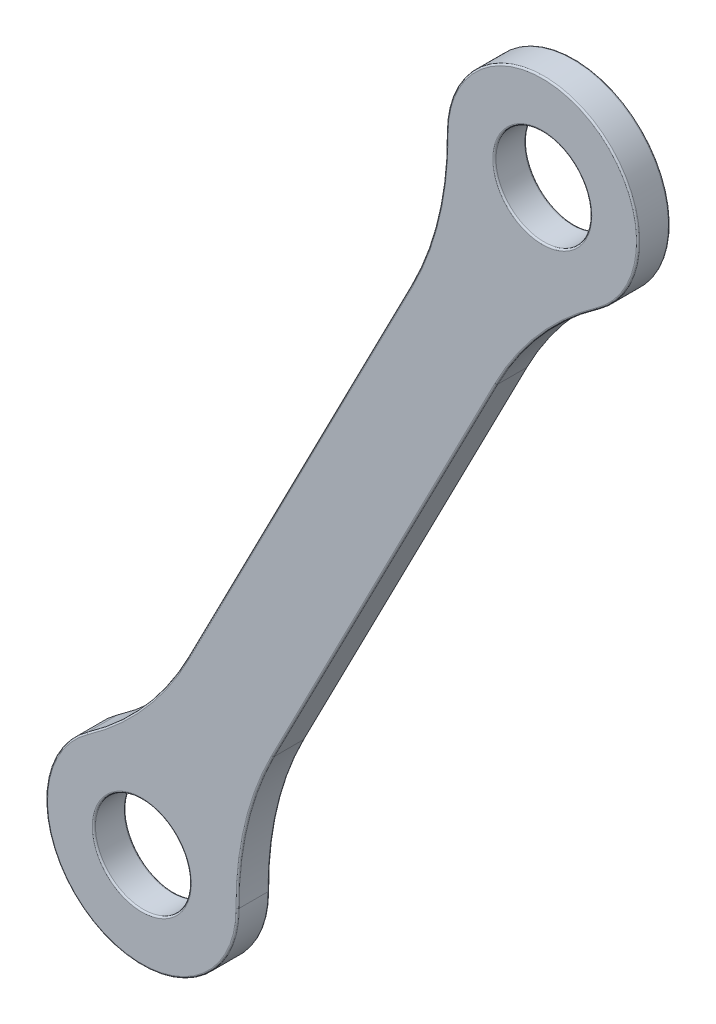
ISO-10303-21;
HEADER;
FILE_DESCRIPTION(('STEP AP214'),'2;1');
FILE_NAME('part.step','',(''),(''),'','','');
FILE_SCHEMA(('AUTOMOTIVE_DESIGN { 1 0 10303 214 1 1 1 1 }'));
ENDSEC;
DATA;
#1=APPLICATION_CONTEXT('core data for automotive mechanical design processes');
#2=APPLICATION_PROTOCOL_DEFINITION('international standard','automotive_design',2000,#1);
#3=PRODUCT_CONTEXT('',#1,'mechanical');
#4=PRODUCT('Part','Part','',(#3));
#5=PRODUCT_RELATED_PRODUCT_CATEGORY('part','',(#4));
#6=PRODUCT_DEFINITION_FORMATION('','',#4);
#7=PRODUCT_DEFINITION_CONTEXT('part definition',#1,'design');
#8=PRODUCT_DEFINITION('design','',#6,#7);
#9=PRODUCT_DEFINITION_SHAPE('','',#8);
#10=(LENGTH_UNIT() NAMED_UNIT(*) SI_UNIT(.MILLI.,.METRE.));
#11=(NAMED_UNIT(*) PLANE_ANGLE_UNIT() SI_UNIT($,.RADIAN.));
#12=(NAMED_UNIT(*) SI_UNIT($,.STERADIAN.) SOLID_ANGLE_UNIT());
#13=UNCERTAINTY_MEASURE_WITH_UNIT(LENGTH_MEASURE(1.E-05),#10,'distance_accuracy_value','');
#14=(GEOMETRIC_REPRESENTATION_CONTEXT(3) GLOBAL_UNCERTAINTY_ASSIGNED_CONTEXT((#13)) GLOBAL_UNIT_ASSIGNED_CONTEXT((#10,
#11,#12)) REPRESENTATION_CONTEXT('',''));
#15=CARTESIAN_POINT('',(0.,0.,0.));
#16=DIRECTION('',(0.,0.,1.));
#17=DIRECTION('',(1.,0.,0.));
#18=AXIS2_PLACEMENT_3D('',#15,#16,#17);
#19=CARTESIAN_POINT('',(-25.6938825812034,13.2208055308789,3.));
#20=DIRECTION('',(-0.889191947851004,0.457534348302876,0.));
#21=DIRECTION('',(-0.457534348302877,-0.889191947851004,0.));
#22=AXIS2_PLACEMENT_3D('',#19,#20,#21);
#23=PLANE('',#22);
#24=DIRECTION('',(0.,0.,-1.));
#25=VECTOR('',#24,1.);
#26=CARTESIAN_POINT('',(18.8195999780896,99.7302236966332,3.));
#27=LINE('',#26,#25);
#28=CARTESIAN_POINT('',(18.8195999780896,99.7302236966332,0.15));
#29=VERTEX_POINT('',#28);
#30=CARTESIAN_POINT('',(18.8195999780896,99.7302236966332,2.85));
#31=VERTEX_POINT('',#30);
#32=EDGE_CURVE('E264',#29,#31,#27,.F.);
#33=ORIENTED_EDGE('',*,*,#32,.T.);
#34=DIRECTION('',(0.457534348302877,0.889191947851004,0.));
#35=VECTOR('',#34,1.);
#36=CARTESIAN_POINT('',(-25.6938825812034,13.2208055308789,2.85));
#37=LINE('',#36,#35);
#38=CARTESIAN_POINT('',(39.7893868769998,140.483810236805,2.85));
#39=VERTEX_POINT('',#38);
#40=EDGE_CURVE('E229',#31,#39,#37,.T.);
#41=ORIENTED_EDGE('',*,*,#40,.T.);
#42=DIRECTION('',(0.,0.,1.));
#43=VECTOR('',#42,1.);
#44=CARTESIAN_POINT('',(39.7893868769998,140.483810236805,0.));
#45=LINE('',#44,#43);
#46=CARTESIAN_POINT('',(39.7893868769998,140.483810236805,0.15));
#47=VERTEX_POINT('',#46);
#48=EDGE_CURVE('E301',#39,#47,#45,.F.);
#49=ORIENTED_EDGE('',*,*,#48,.T.);
#50=DIRECTION('',(0.457534348302877,0.889191947851004,0.));
#51=VECTOR('',#50,1.);
#52=CARTESIAN_POINT('',(18.8195999780896,99.7302236966333,0.15));
#53=LINE('',#52,#51);
#54=EDGE_CURVE('E227',#47,#29,#53,.F.);
#55=ORIENTED_EDGE('',*,*,#54,.T.);
#56=EDGE_LOOP('',(#33,#41,#49,#55));
#57=FACE_BOUND('',#56,.T.);
#58=ADVANCED_FACE('F35',(#57),#23,.T.);
#59=CARTESIAN_POINT('',(14.4999999999999,81.5,3.));
#60=DIRECTION('',(0.,0.,-1.));
#61=DIRECTION('',(-1.,0.,0.));
#62=AXIS2_PLACEMENT_3D('',#59,#60,#61);
#63=CYLINDRICAL_SURFACE('',#62,8.99999999999999);
#64=DIRECTION('',(0.,0.,-1.));
#65=VECTOR('',#64,1.);
#66=CARTESIAN_POINT('',(23.4995582948335,81.5891655644972,3.));
#67=LINE('',#66,#65);
#68=CARTESIAN_POINT('',(23.4995582948335,81.5891655644972,0.15));
#69=VERTEX_POINT('',#68);
#70=CARTESIAN_POINT('',(23.4995582948335,81.5891655644972,2.85));
#71=VERTEX_POINT('',#70);
#72=EDGE_CURVE('E170',#69,#71,#67,.F.);
#73=ORIENTED_EDGE('',*,*,#72,.T.);
#74=CARTESIAN_POINT('',(14.4999999999999,81.5,2.85));
#75=DIRECTION('',(0.,0.,1.));
#76=DIRECTION('',(1.,0.,0.));
#77=AXIS2_PLACEMENT_3D('',#74,#75,#76);
#78=CIRCLE('',#77,8.99999999999999);
#79=CARTESIAN_POINT('',(9.34088650982138,88.8745201874737,2.85));
#80=VERTEX_POINT('',#79);
#81=EDGE_CURVE('E221',#71,#80,#78,.F.);
#82=ORIENTED_EDGE('',*,*,#81,.T.);
#83=DIRECTION('',(0.,0.,-1.));
#84=VECTOR('',#83,1.);
#85=CARTESIAN_POINT('',(9.34088650982138,88.8745201874737,3.));
#86=LINE('',#85,#84);
#87=CARTESIAN_POINT('',(9.34088650982138,88.8745201874737,0.15));
#88=VERTEX_POINT('',#87);
#89=EDGE_CURVE('E320',#80,#88,#86,.T.);
#90=ORIENTED_EDGE('',*,*,#89,.T.);
#91=CARTESIAN_POINT('',(14.4999999999999,81.5,0.15));
#92=DIRECTION('',(0.,0.,1.));
#93=DIRECTION('',(1.,0.,0.));
#94=AXIS2_PLACEMENT_3D('',#91,#92,#93);
#95=CIRCLE('',#94,8.99999999999999);
#96=EDGE_CURVE('E219',#88,#69,#95,.T.);
#97=ORIENTED_EDGE('',*,*,#96,.T.);
#98=EDGE_LOOP('',(#73,#82,#90,#97));
#99=FACE_BOUND('',#98,.T.);
#100=ADVANCED_FACE('F371',(#99),#63,.T.);
#101=CARTESIAN_POINT('',(-17.6911550505444,9.102996396153,3.));
#102=DIRECTION('',(-0.889191947851004,0.457534348302877,0.));
#103=DIRECTION('',(-0.457534348302877,-0.889191947851004,0.));
#104=AXIS2_PLACEMENT_3D('',#101,#102,#103);
#105=PLANE('',#104);
#106=DIRECTION('',(0.,0.,-1.));
#107=VECTOR('',#106,1.);
#108=CARTESIAN_POINT('',(47.7921144076588,136.366001102079,3.));
#109=LINE('',#108,#107);
#110=CARTESIAN_POINT('',(47.7921144076588,136.366001102079,0.15));
#111=VERTEX_POINT('',#110);
#112=CARTESIAN_POINT('',(47.7921144076588,136.366001102079,2.85));
#113=VERTEX_POINT('',#112);
#114=EDGE_CURVE('E317',#111,#113,#109,.F.);
#115=ORIENTED_EDGE('',*,*,#114,.T.);
#116=DIRECTION('',(0.457534348302877,0.889191947851004,0.));
#117=VECTOR('',#116,1.);
#118=CARTESIAN_POINT('',(26.8223275087487,95.6124145619073,2.85));
#119=LINE('',#118,#117);
#120=CARTESIAN_POINT('',(26.8223275087487,95.6124145619073,2.85));
#121=VERTEX_POINT('',#120);
#122=EDGE_CURVE('E212',#113,#121,#119,.F.);
#123=ORIENTED_EDGE('',*,*,#122,.T.);
#124=DIRECTION('',(0.,0.,1.));
#125=VECTOR('',#124,1.);
#126=CARTESIAN_POINT('',(26.8223275087487,95.6124145619073,0.));
#127=LINE('',#126,#125);
#128=CARTESIAN_POINT('',(26.8223275087487,95.6124145619073,0.15));
#129=VERTEX_POINT('',#128);
#130=EDGE_CURVE('E314',#121,#129,#127,.F.);
#131=ORIENTED_EDGE('',*,*,#130,.T.);
#132=DIRECTION('',(0.457534348302877,0.889191947851004,0.));
#133=VECTOR('',#132,1.);
#134=CARTESIAN_POINT('',(-17.6911550505444,9.102996396153,0.15));
#135=LINE('',#134,#133);
#136=EDGE_CURVE('E210',#129,#111,#135,.T.);
#137=ORIENTED_EDGE('',*,*,#136,.T.);
#138=EDGE_LOOP('',(#115,#123,#131,#137));
#139=FACE_BOUND('',#138,.T.);
#140=ADVANCED_FACE('F387',(#139),#105,.F.);
#141=CARTESIAN_POINT('',(52.1117143857485,154.596224798712,3.));
#142=DIRECTION('',(0.,0.,-1.));
#143=DIRECTION('',(-1.,0.,0.));
#144=AXIS2_PLACEMENT_3D('',#141,#142,#143);
#145=CYLINDRICAL_SURFACE('',#144,4.50000000000001);
#146=CARTESIAN_POINT('',(52.1117143857485,154.596224798712,2.85));
#147=DIRECTION('',(0.,0.,1.));
#148=DIRECTION('',(1.,0.,0.));
#149=AXIS2_PLACEMENT_3D('',#146,#147,#148);
#150=CIRCLE('',#149,4.50000000000001);
#151=CARTESIAN_POINT('',(56.6117143857485,154.596224798712,2.85));
#152=VERTEX_POINT('',#151);
#153=EDGE_CURVE('E196',#152,#152,#150,.T.);
#154=ORIENTED_EDGE('',*,*,#153,.T.);
#155=EDGE_LOOP('',(#154));
#156=FACE_BOUND('',#155,.T.);
#157=CARTESIAN_POINT('',(52.1117143857485,154.596224798712,0.15));
#158=DIRECTION('',(0.,0.,1.));
#159=DIRECTION('',(1.,0.,0.));
#160=AXIS2_PLACEMENT_3D('',#157,#158,#159);
#161=CIRCLE('',#160,4.50000000000001);
#162=CARTESIAN_POINT('',(56.6117143857485,154.596224798712,0.15));
#163=VERTEX_POINT('',#162);
#164=EDGE_CURVE('E193',#163,#163,#161,.F.);
#165=ORIENTED_EDGE('',*,*,#164,.T.);
#166=EDGE_LOOP('',(#165));
#167=FACE_BOUND('',#166,.T.);
#168=ADVANCED_FACE('F389',(#156,#167),#145,.F.);
#169=CARTESIAN_POINT('',(52.1117143857485,154.596224798712,3.));
#170=DIRECTION('',(0.,0.,-1.));
#171=DIRECTION('',(-1.,0.,0.));
#172=AXIS2_PLACEMENT_3D('',#169,#170,#171);
#173=CYLINDRICAL_SURFACE('',#172,8.99999999999996);
#174=DIRECTION('',(0.,0.,-1.));
#175=VECTOR('',#174,1.);
#176=CARTESIAN_POINT('',(43.1121560909149,154.507059234215,3.));
#177=LINE('',#176,#175);
#178=CARTESIAN_POINT('',(43.1121560909149,154.507059234215,0.15));
#179=VERTEX_POINT('',#178);
#180=CARTESIAN_POINT('',(43.1121560909149,154.507059234215,2.85));
#181=VERTEX_POINT('',#180);
#182=EDGE_CURVE('E303',#179,#181,#177,.F.);
#183=ORIENTED_EDGE('',*,*,#182,.T.);
#184=CARTESIAN_POINT('',(52.1117143857485,154.596224798712,2.85));
#185=DIRECTION('',(0.,0.,1.));
#186=DIRECTION('',(1.,0.,0.));
#187=AXIS2_PLACEMENT_3D('',#184,#185,#186);
#188=CIRCLE('',#187,8.99999999999996);
#189=CARTESIAN_POINT('',(57.270827875927,147.221704611239,2.85));
#190=VERTEX_POINT('',#189);
#191=EDGE_CURVE('E204',#181,#190,#188,.F.);
#192=ORIENTED_EDGE('',*,*,#191,.T.);
#193=DIRECTION('',(0.,0.,-1.));
#194=VECTOR('',#193,1.);
#195=CARTESIAN_POINT('',(57.270827875927,147.221704611239,3.));
#196=LINE('',#195,#194);
#197=CARTESIAN_POINT('',(57.270827875927,147.221704611239,0.15));
#198=VERTEX_POINT('',#197);
#199=EDGE_CURVE('E307',#190,#198,#196,.T.);
#200=ORIENTED_EDGE('',*,*,#199,.T.);
#201=CARTESIAN_POINT('',(52.1117143857485,154.596224798712,0.15));
#202=DIRECTION('',(0.,0.,1.));
#203=DIRECTION('',(1.,0.,0.));
#204=AXIS2_PLACEMENT_3D('',#201,#202,#203);
#205=CIRCLE('',#204,8.99999999999996);
#206=EDGE_CURVE('E202',#198,#179,#205,.T.);
#207=ORIENTED_EDGE('',*,*,#206,.T.);
#208=EDGE_LOOP('',(#183,#192,#200,#207));
#209=FACE_BOUND('',#208,.T.);
#210=ADVANCED_FACE('F343',(#209),#173,.T.);
#211=CARTESIAN_POINT('',(14.4999999999999,81.5,3.));
#212=DIRECTION('',(0.,0.,-1.));
#213=DIRECTION('',(-1.,0.,0.));
#214=AXIS2_PLACEMENT_3D('',#211,#212,#213);
#215=CYLINDRICAL_SURFACE('',#214,4.5);
#216=CARTESIAN_POINT('',(14.4999999999999,81.5,2.85));
#217=DIRECTION('',(0.,0.,1.));
#218=DIRECTION('',(1.,0.,0.));
#219=AXIS2_PLACEMENT_3D('',#216,#217,#218);
#220=CIRCLE('',#219,4.5);
#221=CARTESIAN_POINT('',(18.9999999999999,81.5,2.85));
#222=VERTEX_POINT('',#221);
#223=EDGE_CURVE('E190',#222,#222,#220,.T.);
#224=ORIENTED_EDGE('',*,*,#223,.T.);
#225=EDGE_LOOP('',(#224));
#226=FACE_BOUND('',#225,.T.);
#227=CARTESIAN_POINT('',(14.4999999999999,81.5,0.15));
#228=DIRECTION('',(0.,0.,1.));
#229=DIRECTION('',(1.,0.,0.));
#230=AXIS2_PLACEMENT_3D('',#227,#228,#229);
#231=CIRCLE('',#230,4.5);
#232=CARTESIAN_POINT('',(18.9999999999999,81.5,0.15));
#233=VERTEX_POINT('',#232);
#234=EDGE_CURVE('E187',#233,#233,#231,.F.);
#235=ORIENTED_EDGE('',*,*,#234,.T.);
#236=EDGE_LOOP('',(#235));
#237=FACE_BOUND('',#236,.T.);
#238=ADVANCED_FACE('F545',(#226,#237),#215,.F.);
#239=CARTESIAN_POINT('',(0.,0.,3.));
#240=DIRECTION('',(0.,0.,1.));
#241=DIRECTION('',(1.,0.,0.));
#242=AXIS2_PLACEMENT_3D('',#239,#240,#241);
#243=PLANE('',#242);
#244=CARTESIAN_POINT('',(14.4999999999999,81.5,3.));
#245=DIRECTION('',(0.,0.,1.));
#246=DIRECTION('',(1.,0.,0.));
#247=AXIS2_PLACEMENT_3D('',#244,#245,#246);
#248=CIRCLE('',#247,4.65);
#249=CARTESIAN_POINT('',(19.1499999999999,81.5,3.));
#250=VERTEX_POINT('',#249);
#251=EDGE_CURVE('E179',#250,#250,#248,.F.);
#252=ORIENTED_EDGE('',*,*,#251,.T.);
#253=EDGE_LOOP('',(#252));
#254=FACE_BOUND('',#253,.T.);
#255=CARTESIAN_POINT('',(52.1117143857485,154.596224798712,3.));
#256=DIRECTION('',(0.,0.,1.));
#257=DIRECTION('',(1.,0.,0.));
#258=AXIS2_PLACEMENT_3D('',#255,#256,#257);
#259=CIRCLE('',#258,4.65000000000001);
#260=CARTESIAN_POINT('',(56.7617143857485,154.596224798712,3.));
#261=VERTEX_POINT('',#260);
#262=EDGE_CURVE('E176',#261,#261,#259,.F.);
#263=ORIENTED_EDGE('',*,*,#262,.T.);
#264=EDGE_LOOP('',(#263));
#265=FACE_BOUND('',#264,.T.);
#266=CARTESIAN_POINT('',(52.1117143857485,154.596224798712,3.));
#267=DIRECTION('',(0.,0.,1.));
#268=DIRECTION('',(1.,0.,0.));
#269=AXIS2_PLACEMENT_3D('',#266,#267,#268);
#270=CIRCLE('',#269,8.84999999999996);
#271=CARTESIAN_POINT('',(57.1848426510907,147.34461328103,3.));
#272=VERTEX_POINT('',#271);
#273=CARTESIAN_POINT('',(43.2621487291622,154.508545326957,3.));
#274=VERTEX_POINT('',#273);
#275=EDGE_CURVE('E174',#272,#274,#270,.T.);
#276=ORIENTED_EDGE('',*,*,#275,.T.);
#277=CARTESIAN_POINT('',(13.1136284414697,154.209840685891,3.));
#278=DIRECTION('',(0.,0.,1.));
#279=DIRECTION('',(1.,0.,0.));
#280=AXIS2_PLACEMENT_3D('',#277,#278,#279);
#281=CIRCLE('',#280,30.15);
#282=CARTESIAN_POINT('',(39.9227656691774,140.41518008456,3.));
#283=VERTEX_POINT('',#282);
#284=EDGE_CURVE('E155',#274,#283,#281,.F.);
#285=ORIENTED_EDGE('',*,*,#284,.T.);
#286=DIRECTION('',(0.457534348302877,0.889191947851004,0.));
#287=VECTOR('',#286,1.);
#288=CARTESIAN_POINT('',(-25.5605037890257,13.1521753786335,3.));
#289=LINE('',#288,#287);
#290=CARTESIAN_POINT('',(18.9529787702673,99.6615935443878,3.));
#291=VERTEX_POINT('',#290);
#292=EDGE_CURVE('E163',#283,#291,#289,.F.);
#293=ORIENTED_EDGE('',*,*,#292,.T.);
#294=CARTESIAN_POINT('',(-7.85615845744048,113.456254145719,3.));
#295=DIRECTION('',(0.,0.,1.));
#296=DIRECTION('',(1.,0.,0.));
#297=AXIS2_PLACEMENT_3D('',#294,#295,#296);
#298=CIRCLE('',#297,30.15);
#299=CARTESIAN_POINT('',(9.42687173465769,88.7516115176825,3.));
#300=VERTEX_POINT('',#299);
#301=EDGE_CURVE('E169',#291,#300,#298,.F.);
#302=ORIENTED_EDGE('',*,*,#301,.T.);
#303=CARTESIAN_POINT('',(14.4999999999999,81.5,3.));
#304=DIRECTION('',(0.,0.,1.));
#305=DIRECTION('',(1.,0.,0.));
#306=AXIS2_PLACEMENT_3D('',#303,#304,#305);
#307=CIRCLE('',#306,8.84999999999999);
#308=CARTESIAN_POINT('',(23.3495656565863,81.5876794717555,3.));
#309=VERTEX_POINT('',#308);
#310=EDGE_CURVE('E326',#300,#309,#307,.T.);
#311=ORIENTED_EDGE('',*,*,#310,.T.);
#312=CARTESIAN_POINT('',(53.4980859442788,81.886384112821,3.));
#313=DIRECTION('',(0.,0.,1.));
#314=DIRECTION('',(1.,0.,0.));
#315=AXIS2_PLACEMENT_3D('',#312,#313,#314);
#316=CIRCLE('',#315,30.15);
#317=CARTESIAN_POINT('',(26.688948716571,95.6810447141527,3.));
#318=VERTEX_POINT('',#317);
#319=EDGE_CURVE('E328',#309,#318,#316,.F.);
#320=ORIENTED_EDGE('',*,*,#319,.T.);
#321=DIRECTION('',(0.457534348302877,0.889191947851004,0.));
#322=VECTOR('',#321,1.);
#323=CARTESIAN_POINT('',(47.6587356154812,136.434631254325,3.));
#324=LINE('',#323,#322);
#325=CARTESIAN_POINT('',(47.6587356154812,136.434631254325,3.));
#326=VERTEX_POINT('',#325);
#327=EDGE_CURVE('E330',#318,#326,#324,.T.);
#328=ORIENTED_EDGE('',*,*,#327,.T.);
#329=CARTESIAN_POINT('',(74.467872843189,122.639970652993,3.));
#330=DIRECTION('',(0.,0.,1.));
#331=DIRECTION('',(1.,0.,0.));
#332=AXIS2_PLACEMENT_3D('',#329,#330,#331);
#333=CIRCLE('',#332,30.15);
#334=EDGE_CURVE('E181',#326,#272,#333,.F.);
#335=ORIENTED_EDGE('',*,*,#334,.T.);
#336=EDGE_LOOP('',(#276,#285,#293,#302,#311,#320,#328,#335));
#337=FACE_BOUND('',#336,.T.);
#338=ADVANCED_FACE('F172',(#254,#265,#337),#243,.T.);
#339=CARTESIAN_POINT('',(0.,0.,0.));
#340=DIRECTION('',(0.,0.,1.));
#341=DIRECTION('',(1.,0.,0.));
#342=AXIS2_PLACEMENT_3D('',#339,#340,#341);
#343=PLANE('',#342);
#344=CARTESIAN_POINT('',(14.4999999999999,81.5,0.));
#345=DIRECTION('',(0.,0.,1.));
#346=DIRECTION('',(1.,0.,0.));
#347=AXIS2_PLACEMENT_3D('',#344,#345,#346);
#348=CIRCLE('',#347,4.65);
#349=CARTESIAN_POINT('',(19.1499999999999,81.5,0.));
#350=VERTEX_POINT('',#349);
#351=EDGE_CURVE('E11',#350,#350,#348,.T.);
#352=ORIENTED_EDGE('',*,*,#351,.T.);
#353=EDGE_LOOP('',(#352));
#354=FACE_BOUND('',#353,.T.);
#355=CARTESIAN_POINT('',(52.1117143857485,154.596224798712,0.));
#356=DIRECTION('',(0.,0.,1.));
#357=DIRECTION('',(1.,0.,0.));
#358=AXIS2_PLACEMENT_3D('',#355,#356,#357);
#359=CIRCLE('',#358,4.65000000000001);
#360=CARTESIAN_POINT('',(56.7617143857485,154.596224798712,0.));
#361=VERTEX_POINT('',#360);
#362=EDGE_CURVE('E44',#361,#361,#359,.T.);
#363=ORIENTED_EDGE('',*,*,#362,.T.);
#364=EDGE_LOOP('',(#363));
#365=FACE_BOUND('',#364,.T.);
#366=DIRECTION('',(0.457534348302877,0.889191947851004,0.));
#367=VECTOR('',#366,1.);
#368=CARTESIAN_POINT('',(-17.824533842722,9.17162654839843,0.));
#369=LINE('',#368,#367);
#370=CARTESIAN_POINT('',(47.6587356154812,136.434631254325,0.));
#371=VERTEX_POINT('',#370);
#372=CARTESIAN_POINT('',(26.688948716571,95.6810447141527,0.));
#373=VERTEX_POINT('',#372);
#374=EDGE_CURVE('E52',#371,#373,#369,.F.);
#375=ORIENTED_EDGE('',*,*,#374,.T.);
#376=CARTESIAN_POINT('',(53.4980859442788,81.886384112821,0.));
#377=DIRECTION('',(0.,0.,1.));
#378=DIRECTION('',(1.,0.,0.));
#379=AXIS2_PLACEMENT_3D('',#376,#377,#378);
#380=CIRCLE('',#379,30.15);
#381=CARTESIAN_POINT('',(23.3495656565863,81.5876794717555,0.));
#382=VERTEX_POINT('',#381);
#383=EDGE_CURVE('E243',#373,#382,#380,.T.);
#384=ORIENTED_EDGE('',*,*,#383,.T.);
#385=CARTESIAN_POINT('',(14.4999999999999,81.5,0.));
#386=DIRECTION('',(0.,0.,1.));
#387=DIRECTION('',(1.,0.,0.));
#388=AXIS2_PLACEMENT_3D('',#385,#386,#387);
#389=CIRCLE('',#388,8.84999999999999);
#390=CARTESIAN_POINT('',(9.42687173465769,88.7516115176825,0.));
#391=VERTEX_POINT('',#390);
#392=EDGE_CURVE('E231',#382,#391,#389,.F.);
#393=ORIENTED_EDGE('',*,*,#392,.T.);
#394=CARTESIAN_POINT('',(-7.85615845744048,113.456254145719,0.));
#395=DIRECTION('',(0.,0.,1.));
#396=DIRECTION('',(1.,0.,0.));
#397=AXIS2_PLACEMENT_3D('',#394,#395,#396);
#398=CIRCLE('',#397,30.15);
#399=CARTESIAN_POINT('',(18.9529787702673,99.6615935443878,0.));
#400=VERTEX_POINT('',#399);
#401=EDGE_CURVE('E233',#391,#400,#398,.T.);
#402=ORIENTED_EDGE('',*,*,#401,.T.);
#403=DIRECTION('',(0.457534348302877,0.889191947851004,0.));
#404=VECTOR('',#403,1.);
#405=CARTESIAN_POINT('',(39.9227656691775,140.41518008456,0.));
#406=LINE('',#405,#404);
#407=CARTESIAN_POINT('',(39.9227656691774,140.41518008456,0.));
#408=VERTEX_POINT('',#407);
#409=EDGE_CURVE('E235',#400,#408,#406,.T.);
#410=ORIENTED_EDGE('',*,*,#409,.T.);
#411=CARTESIAN_POINT('',(13.1136284414697,154.209840685891,0.));
#412=DIRECTION('',(0.,0.,1.));
#413=DIRECTION('',(1.,0.,0.));
#414=AXIS2_PLACEMENT_3D('',#411,#412,#413);
#415=CIRCLE('',#414,30.15);
#416=CARTESIAN_POINT('',(43.2621487291622,154.508545326957,0.));
#417=VERTEX_POINT('',#416);
#418=EDGE_CURVE('E237',#408,#417,#415,.T.);
#419=ORIENTED_EDGE('',*,*,#418,.T.);
#420=CARTESIAN_POINT('',(52.1117143857485,154.596224798712,0.));
#421=DIRECTION('',(0.,0.,1.));
#422=DIRECTION('',(1.,0.,0.));
#423=AXIS2_PLACEMENT_3D('',#420,#421,#422);
#424=CIRCLE('',#423,8.84999999999996);
#425=CARTESIAN_POINT('',(57.1848426510907,147.34461328103,0.));
#426=VERTEX_POINT('',#425);
#427=EDGE_CURVE('E239',#417,#426,#424,.F.);
#428=ORIENTED_EDGE('',*,*,#427,.T.);
#429=CARTESIAN_POINT('',(74.467872843189,122.639970652993,0.));
#430=DIRECTION('',(0.,0.,1.));
#431=DIRECTION('',(1.,0.,0.));
#432=AXIS2_PLACEMENT_3D('',#429,#430,#431);
#433=CIRCLE('',#432,30.15);
#434=EDGE_CURVE('E57',#426,#371,#433,.T.);
#435=ORIENTED_EDGE('',*,*,#434,.T.);
#436=EDGE_LOOP('',(#375,#384,#393,#402,#410,#419,#428,#435));
#437=FACE_BOUND('',#436,.T.);
#438=ADVANCED_FACE('F359',(#354,#365,#437),#343,.F.);
#439=CARTESIAN_POINT('',(13.1136284414697,154.209840685891,3.));
#440=DIRECTION('',(0.,0.,-1.));
#441=DIRECTION('',(-1.,0.,0.));
#442=AXIS2_PLACEMENT_3D('',#439,#440,#441);
#443=CYLINDRICAL_SURFACE('',#442,30.);
#444=ORIENTED_EDGE('',*,*,#48,.F.);
#445=CARTESIAN_POINT('',(13.1136284414697,154.209840685891,2.85));
#446=DIRECTION('',(0.,0.,1.));
#447=DIRECTION('',(1.,0.,0.));
#448=AXIS2_PLACEMENT_3D('',#445,#446,#447);
#449=CIRCLE('',#448,30.);
#450=EDGE_CURVE('E157',#39,#181,#449,.T.);
#451=ORIENTED_EDGE('',*,*,#450,.T.);
#452=ORIENTED_EDGE('',*,*,#182,.F.);
#453=CARTESIAN_POINT('',(13.1136284414697,154.209840685891,0.15));
#454=DIRECTION('',(0.,0.,1.));
#455=DIRECTION('',(1.,0.,0.));
#456=AXIS2_PLACEMENT_3D('',#453,#454,#455);
#457=CIRCLE('',#456,30.);
#458=EDGE_CURVE('E199',#179,#47,#457,.F.);
#459=ORIENTED_EDGE('',*,*,#458,.T.);
#460=EDGE_LOOP('',(#444,#451,#452,#459));
#461=FACE_BOUND('',#460,.T.);
#462=ADVANCED_FACE('F300',(#461),#443,.F.);
#463=CARTESIAN_POINT('',(74.467872843189,122.639970652993,3.));
#464=DIRECTION('',(0.,0.,-1.));
#465=DIRECTION('',(-1.,0.,0.));
#466=AXIS2_PLACEMENT_3D('',#463,#464,#465);
#467=CYLINDRICAL_SURFACE('',#466,30.);
#468=ORIENTED_EDGE('',*,*,#199,.F.);
#469=CARTESIAN_POINT('',(74.467872843189,122.639970652993,2.85));
#470=DIRECTION('',(0.,0.,1.));
#471=DIRECTION('',(1.,0.,0.));
#472=AXIS2_PLACEMENT_3D('',#469,#470,#471);
#473=CIRCLE('',#472,30.);
#474=EDGE_CURVE('E208',#190,#113,#473,.T.);
#475=ORIENTED_EDGE('',*,*,#474,.T.);
#476=ORIENTED_EDGE('',*,*,#114,.F.);
#477=CARTESIAN_POINT('',(74.467872843189,122.639970652993,0.15));
#478=DIRECTION('',(0.,0.,1.));
#479=DIRECTION('',(1.,0.,0.));
#480=AXIS2_PLACEMENT_3D('',#477,#478,#479);
#481=CIRCLE('',#480,30.);
#482=EDGE_CURVE('E206',#111,#198,#481,.F.);
#483=ORIENTED_EDGE('',*,*,#482,.T.);
#484=EDGE_LOOP('',(#468,#475,#476,#483));
#485=FACE_BOUND('',#484,.T.);
#486=ADVANCED_FACE('F345',(#485),#467,.F.);
#487=CARTESIAN_POINT('',(53.4980859442788,81.886384112821,3.));
#488=DIRECTION('',(0.,0.,-1.));
#489=DIRECTION('',(-1.,0.,0.));
#490=AXIS2_PLACEMENT_3D('',#487,#488,#489);
#491=CYLINDRICAL_SURFACE('',#490,30.);
#492=ORIENTED_EDGE('',*,*,#130,.F.);
#493=CARTESIAN_POINT('',(53.4980859442788,81.886384112821,2.85));
#494=DIRECTION('',(0.,0.,1.));
#495=DIRECTION('',(1.,0.,0.));
#496=AXIS2_PLACEMENT_3D('',#493,#494,#495);
#497=CIRCLE('',#496,30.);
#498=EDGE_CURVE('E217',#121,#71,#497,.T.);
#499=ORIENTED_EDGE('',*,*,#498,.T.);
#500=ORIENTED_EDGE('',*,*,#72,.F.);
#501=CARTESIAN_POINT('',(53.4980859442788,81.886384112821,0.15));
#502=DIRECTION('',(0.,0.,1.));
#503=DIRECTION('',(1.,0.,0.));
#504=AXIS2_PLACEMENT_3D('',#501,#502,#503);
#505=CIRCLE('',#504,30.);
#506=EDGE_CURVE('E214',#69,#129,#505,.F.);
#507=ORIENTED_EDGE('',*,*,#506,.T.);
#508=EDGE_LOOP('',(#492,#499,#500,#507));
#509=FACE_BOUND('',#508,.T.);
#510=ADVANCED_FACE('F376',(#509),#491,.F.);
#511=CARTESIAN_POINT('',(-7.85615845744048,113.456254145719,3.));
#512=DIRECTION('',(0.,0.,-1.));
#513=DIRECTION('',(-1.,0.,0.));
#514=AXIS2_PLACEMENT_3D('',#511,#512,#513);
#515=CYLINDRICAL_SURFACE('',#514,30.);
#516=ORIENTED_EDGE('',*,*,#89,.F.);
#517=CARTESIAN_POINT('',(-7.85615845744048,113.456254145719,2.85));
#518=DIRECTION('',(0.,0.,1.));
#519=DIRECTION('',(1.,0.,0.));
#520=AXIS2_PLACEMENT_3D('',#517,#518,#519);
#521=CIRCLE('',#520,30.);
#522=EDGE_CURVE('E225',#80,#31,#521,.T.);
#523=ORIENTED_EDGE('',*,*,#522,.T.);
#524=ORIENTED_EDGE('',*,*,#32,.F.);
#525=CARTESIAN_POINT('',(-7.85615845744048,113.456254145719,0.15));
#526=DIRECTION('',(0.,0.,1.));
#527=DIRECTION('',(1.,0.,0.));
#528=AXIS2_PLACEMENT_3D('',#525,#526,#527);
#529=CIRCLE('',#528,30.);
#530=EDGE_CURVE('E223',#29,#88,#529,.F.);
#531=ORIENTED_EDGE('',*,*,#530,.T.);
#532=EDGE_LOOP('',(#516,#523,#524,#531));
#533=FACE_BOUND('',#532,.T.);
#534=ADVANCED_FACE('F410',(#533),#515,.F.);
#535=CARTESIAN_POINT('',(14.4999999999999,81.5,2.85));
#536=DIRECTION('',(0.,0.,1.));
#537=DIRECTION('',(1.,0.,0.));
#538=AXIS2_PLACEMENT_3D('',#535,#536,#537);
#539=TOROIDAL_SURFACE('',#538,4.65,0.15);
#540=ORIENTED_EDGE('',*,*,#223,.F.);
#541=EDGE_LOOP('',(#540));
#542=FACE_BOUND('',#541,.T.);
#543=ORIENTED_EDGE('',*,*,#251,.F.);
#544=EDGE_LOOP('',(#543));
#545=FACE_BOUND('',#544,.T.);
#546=ADVANCED_FACE('F413',(#542,#545),#539,.T.);
#547=CARTESIAN_POINT('',(52.1117143857485,154.596224798712,2.85));
#548=DIRECTION('',(0.,0.,1.));
#549=DIRECTION('',(1.,0.,0.));
#550=AXIS2_PLACEMENT_3D('',#547,#548,#549);
#551=TOROIDAL_SURFACE('',#550,4.65000000000001,0.15);
#552=ORIENTED_EDGE('',*,*,#262,.F.);
#553=EDGE_LOOP('',(#552));
#554=FACE_BOUND('',#553,.T.);
#555=ORIENTED_EDGE('',*,*,#153,.F.);
#556=EDGE_LOOP('',(#555));
#557=FACE_BOUND('',#556,.T.);
#558=ADVANCED_FACE('F417',(#554,#557),#551,.T.);
#559=CARTESIAN_POINT('',(53.4980859442788,81.886384112821,2.85));
#560=DIRECTION('',(0.,0.,1.));
#561=DIRECTION('',(1.,0.,0.));
#562=AXIS2_PLACEMENT_3D('',#559,#560,#561);
#563=TOROIDAL_SURFACE('',#562,30.15,0.15);
#564=CARTESIAN_POINT('',(23.3495656565863,81.5876794717555,2.85));
#565=DIRECTION('',(0.00990728494409947,-0.999950921648176,0.));
#566=DIRECTION('',(0.999950921648176,0.00990728494409947,0.));
#567=AXIS2_PLACEMENT_3D('',#564,#565,#566);
#568=CIRCLE('',#567,0.15);
#569=EDGE_CURVE('E258',#71,#309,#568,.T.);
#570=ORIENTED_EDGE('',*,*,#569,.F.);
#571=ORIENTED_EDGE('',*,*,#498,.F.);
#572=CARTESIAN_POINT('',(26.688948716571,95.6810447141527,2.85));
#573=DIRECTION('',(0.457534348302833,0.889191947851026,0.));
#574=DIRECTION('',(-0.889191947851026,0.457534348302833,0.));
#575=AXIS2_PLACEMENT_3D('',#572,#573,#574);
#576=CIRCLE('',#575,0.15);
#577=EDGE_CURVE('E261',#318,#121,#576,.T.);
#578=ORIENTED_EDGE('',*,*,#577,.F.);
#579=ORIENTED_EDGE('',*,*,#319,.F.);
#580=EDGE_LOOP('',(#570,#571,#578,#579));
#581=FACE_BOUND('',#580,.T.);
#582=ADVANCED_FACE('F380',(#581),#563,.T.);
#583=CARTESIAN_POINT('',(-17.824533842722,9.17162654839843,2.85));
#584=DIRECTION('',(-0.457534348302877,-0.889191947851004,0.));
#585=DIRECTION('',(0.889191947851004,-0.457534348302877,0.));
#586=AXIS2_PLACEMENT_3D('',#583,#584,#585);
#587=CYLINDRICAL_SURFACE('',#586,0.15);
#588=ORIENTED_EDGE('',*,*,#577,.T.);
#589=ORIENTED_EDGE('',*,*,#122,.F.);
#590=CARTESIAN_POINT('',(47.6587356154812,136.434631254325,2.85));
#591=DIRECTION('',(0.457534348302796,0.889191947851045,0.));
#592=DIRECTION('',(-0.889191947851045,0.457534348302796,0.));
#593=AXIS2_PLACEMENT_3D('',#590,#591,#592);
#594=CIRCLE('',#593,0.15);
#595=EDGE_CURVE('E255',#326,#113,#594,.T.);
#596=ORIENTED_EDGE('',*,*,#595,.F.);
#597=ORIENTED_EDGE('',*,*,#327,.F.);
#598=EDGE_LOOP('',(#588,#589,#596,#597));
#599=FACE_BOUND('',#598,.T.);
#600=ADVANCED_FACE('F385',(#599),#587,.T.);
#601=CARTESIAN_POINT('',(14.4999999999999,81.5,2.85));
#602=DIRECTION('',(0.,0.,1.));
#603=DIRECTION('',(1.,0.,0.));
#604=AXIS2_PLACEMENT_3D('',#601,#602,#603);
#605=TOROIDAL_SURFACE('',#604,8.84999999999999,0.15);
#606=ORIENTED_EDGE('',*,*,#569,.T.);
#607=ORIENTED_EDGE('',*,*,#310,.F.);
#608=CARTESIAN_POINT('',(9.42687173465769,88.7516115176825,2.85));
#609=DIRECTION('',(0.819391131941522,0.573234832242068,0.));
#610=DIRECTION('',(-0.573234832242068,0.819391131941522,0.));
#611=AXIS2_PLACEMENT_3D('',#608,#609,#610);
#612=CIRCLE('',#611,0.15);
#613=EDGE_CURVE('E252',#80,#300,#612,.T.);
#614=ORIENTED_EDGE('',*,*,#613,.F.);
#615=ORIENTED_EDGE('',*,*,#81,.F.);
#616=EDGE_LOOP('',(#606,#607,#614,#615));
#617=FACE_BOUND('',#616,.T.);
#618=ADVANCED_FACE('F435',(#617),#605,.T.);
#619=CARTESIAN_POINT('',(74.467872843189,122.639970652993,2.85));
#620=DIRECTION('',(0.,0.,1.));
#621=DIRECTION('',(1.,0.,0.));
#622=AXIS2_PLACEMENT_3D('',#619,#620,#621);
#623=TOROIDAL_SURFACE('',#622,30.15,0.15);
#624=ORIENTED_EDGE('',*,*,#595,.T.);
#625=ORIENTED_EDGE('',*,*,#474,.F.);
#626=CARTESIAN_POINT('',(57.1848426510907,147.34461328103,2.85));
#627=DIRECTION('',(0.819391131941533,0.573234832242052,0.));
#628=DIRECTION('',(-0.573234832242052,0.819391131941533,0.));
#629=AXIS2_PLACEMENT_3D('',#626,#627,#628);
#630=CIRCLE('',#629,0.15);
#631=EDGE_CURVE('E249',#272,#190,#630,.T.);
#632=ORIENTED_EDGE('',*,*,#631,.F.);
#633=ORIENTED_EDGE('',*,*,#334,.F.);
#634=EDGE_LOOP('',(#624,#625,#632,#633));
#635=FACE_BOUND('',#634,.T.);
#636=ADVANCED_FACE('F337',(#635),#623,.T.);
#637=CARTESIAN_POINT('',(-7.85615845744048,113.456254145719,2.85));
#638=DIRECTION('',(0.,0.,1.));
#639=DIRECTION('',(1.,0.,0.));
#640=AXIS2_PLACEMENT_3D('',#637,#638,#639);
#641=TOROIDAL_SURFACE('',#640,30.15,0.15);
#642=ORIENTED_EDGE('',*,*,#613,.T.);
#643=ORIENTED_EDGE('',*,*,#301,.F.);
#644=CARTESIAN_POINT('',(18.9529787702673,99.6615935443878,2.85));
#645=DIRECTION('',(0.457534348302843,0.889191947851021,0.));
#646=DIRECTION('',(-0.889191947851021,0.457534348302843,0.));
#647=AXIS2_PLACEMENT_3D('',#644,#645,#646);
#648=CIRCLE('',#647,0.15);
#649=EDGE_CURVE('E166',#31,#291,#648,.T.);
#650=ORIENTED_EDGE('',*,*,#649,.F.);
#651=ORIENTED_EDGE('',*,*,#522,.F.);
#652=EDGE_LOOP('',(#642,#643,#650,#651));
#653=FACE_BOUND('',#652,.T.);
#654=ADVANCED_FACE('F429',(#653),#641,.T.);
#655=CARTESIAN_POINT('',(52.1117143857485,154.596224798712,2.85));
#656=DIRECTION('',(0.,0.,1.));
#657=DIRECTION('',(1.,0.,0.));
#658=AXIS2_PLACEMENT_3D('',#655,#656,#657);
#659=TOROIDAL_SURFACE('',#658,8.84999999999996,0.15);
#660=ORIENTED_EDGE('',*,*,#631,.T.);
#661=ORIENTED_EDGE('',*,*,#191,.F.);
#662=CARTESIAN_POINT('',(43.2621487291622,154.508545326957,2.85));
#663=DIRECTION('',(0.00990728494409947,-0.999950921648176,0.));
#664=DIRECTION('',(0.999950921648176,0.00990728494409947,0.));
#665=AXIS2_PLACEMENT_3D('',#662,#663,#664);
#666=CIRCLE('',#665,0.15);
#667=EDGE_CURVE('E160',#274,#181,#666,.T.);
#668=ORIENTED_EDGE('',*,*,#667,.F.);
#669=ORIENTED_EDGE('',*,*,#275,.F.);
#670=EDGE_LOOP('',(#660,#661,#668,#669));
#671=FACE_BOUND('',#670,.T.);
#672=ADVANCED_FACE('F340',(#671),#659,.T.);
#673=CARTESIAN_POINT('',(-25.5605037890257,13.1521753786335,2.85));
#674=DIRECTION('',(0.457534348302877,0.889191947851004,0.));
#675=DIRECTION('',(-0.889191947851004,0.457534348302876,0.));
#676=AXIS2_PLACEMENT_3D('',#673,#674,#675);
#677=CYLINDRICAL_SURFACE('',#676,0.15);
#678=ORIENTED_EDGE('',*,*,#649,.T.);
#679=ORIENTED_EDGE('',*,*,#292,.F.);
#680=CARTESIAN_POINT('',(39.9227656691774,140.41518008456,2.85));
#681=DIRECTION('',(0.457534348302833,0.889191947851026,0.));
#682=DIRECTION('',(-0.889191947851026,0.457534348302833,0.));
#683=AXIS2_PLACEMENT_3D('',#680,#681,#682);
#684=CIRCLE('',#683,0.15);
#685=EDGE_CURVE('E151',#39,#283,#684,.T.);
#686=ORIENTED_EDGE('',*,*,#685,.F.);
#687=ORIENTED_EDGE('',*,*,#40,.F.);
#688=EDGE_LOOP('',(#678,#679,#686,#687));
#689=FACE_BOUND('',#688,.T.);
#690=ADVANCED_FACE('F164',(#689),#677,.T.);
#691=CARTESIAN_POINT('',(13.1136284414697,154.209840685891,2.85));
#692=DIRECTION('',(0.,0.,1.));
#693=DIRECTION('',(1.,0.,0.));
#694=AXIS2_PLACEMENT_3D('',#691,#692,#693);
#695=TOROIDAL_SURFACE('',#694,30.15,0.15);
#696=ORIENTED_EDGE('',*,*,#667,.T.);
#697=ORIENTED_EDGE('',*,*,#450,.F.);
#698=ORIENTED_EDGE('',*,*,#685,.T.);
#699=ORIENTED_EDGE('',*,*,#284,.F.);
#700=EDGE_LOOP('',(#696,#697,#698,#699));
#701=FACE_BOUND('',#700,.T.);
#702=ADVANCED_FACE('F153',(#701),#695,.T.);
#703=CARTESIAN_POINT('',(14.4999999999999,81.5,0.15));
#704=DIRECTION('',(0.,0.,1.));
#705=DIRECTION('',(1.,0.,0.));
#706=AXIS2_PLACEMENT_3D('',#703,#704,#705);
#707=TOROIDAL_SURFACE('',#706,4.65,0.15);
#708=ORIENTED_EDGE('',*,*,#351,.F.);
#709=EDGE_LOOP('',(#708));
#710=FACE_BOUND('',#709,.T.);
#711=ORIENTED_EDGE('',*,*,#234,.F.);
#712=EDGE_LOOP('',(#711));
#713=FACE_BOUND('',#712,.T.);
#714=ADVANCED_FACE('F424',(#710,#713),#707,.T.);
#715=CARTESIAN_POINT('',(52.1117143857485,154.596224798712,0.15));
#716=DIRECTION('',(0.,0.,1.));
#717=DIRECTION('',(1.,0.,0.));
#718=AXIS2_PLACEMENT_3D('',#715,#716,#717);
#719=TOROIDAL_SURFACE('',#718,4.65000000000001,0.15);
#720=ORIENTED_EDGE('',*,*,#164,.F.);
#721=EDGE_LOOP('',(#720));
#722=FACE_BOUND('',#721,.T.);
#723=ORIENTED_EDGE('',*,*,#362,.F.);
#724=EDGE_LOOP('',(#723));
#725=FACE_BOUND('',#724,.T.);
#726=ADVANCED_FACE('F445',(#722,#725),#719,.T.);
#727=CARTESIAN_POINT('',(13.1136284414697,154.209840685891,0.15));
#728=DIRECTION('',(0.,0.,1.));
#729=DIRECTION('',(1.,0.,0.));
#730=AXIS2_PLACEMENT_3D('',#727,#728,#729);
#731=TOROIDAL_SURFACE('',#730,30.15,0.15);
#732=CARTESIAN_POINT('',(39.9227656691774,140.41518008456,0.15));
#733=DIRECTION('',(-0.457534348302833,-0.889191947851026,0.));
#734=DIRECTION('',(0.889191947851026,-0.457534348302833,0.));
#735=AXIS2_PLACEMENT_3D('',#732,#733,#734);
#736=CIRCLE('',#735,0.15);
#737=EDGE_CURVE('E280',#47,#408,#736,.T.);
#738=ORIENTED_EDGE('',*,*,#737,.F.);
#739=ORIENTED_EDGE('',*,*,#458,.F.);
#740=CARTESIAN_POINT('',(43.2621487291622,154.508545326957,0.15));
#741=DIRECTION('',(-0.00990728494409947,0.999950921648176,0.));
#742=DIRECTION('',(-0.999950921648176,-0.00990728494409947,0.));
#743=AXIS2_PLACEMENT_3D('',#740,#741,#742);
#744=CIRCLE('',#743,0.15);
#745=EDGE_CURVE('E39',#417,#179,#744,.T.);
#746=ORIENTED_EDGE('',*,*,#745,.F.);
#747=ORIENTED_EDGE('',*,*,#418,.F.);
#748=EDGE_LOOP('',(#738,#739,#746,#747));
#749=FACE_BOUND('',#748,.T.);
#750=ADVANCED_FACE('F37',(#749),#731,.T.);
#751=CARTESIAN_POINT('',(52.1117143857485,154.596224798712,0.15));
#752=DIRECTION('',(0.,0.,1.));
#753=DIRECTION('',(1.,0.,0.));
#754=AXIS2_PLACEMENT_3D('',#751,#752,#753);
#755=TOROIDAL_SURFACE('',#754,8.84999999999996,0.15);
#756=ORIENTED_EDGE('',*,*,#745,.T.);
#757=ORIENTED_EDGE('',*,*,#206,.F.);
#758=CARTESIAN_POINT('',(57.1848426510907,147.34461328103,0.15));
#759=DIRECTION('',(-0.819391131941533,-0.573234832242052,0.));
#760=DIRECTION('',(0.573234832242052,-0.819391131941533,0.));
#761=AXIS2_PLACEMENT_3D('',#758,#759,#760);
#762=CIRCLE('',#761,0.15);
#763=EDGE_CURVE('E278',#426,#198,#762,.T.);
#764=ORIENTED_EDGE('',*,*,#763,.F.);
#765=ORIENTED_EDGE('',*,*,#427,.F.);
#766=EDGE_LOOP('',(#756,#757,#764,#765));
#767=FACE_BOUND('',#766,.T.);
#768=ADVANCED_FACE('F291',(#767),#755,.T.);
#769=CARTESIAN_POINT('',(-25.5605037890257,13.1521753786335,0.15));
#770=DIRECTION('',(-0.457534348302877,-0.889191947851004,0.));
#771=DIRECTION('',(0.889191947851004,-0.457534348302876,0.));
#772=AXIS2_PLACEMENT_3D('',#769,#770,#771);
#773=CYLINDRICAL_SURFACE('',#772,0.15);
#774=ORIENTED_EDGE('',*,*,#737,.T.);
#775=ORIENTED_EDGE('',*,*,#409,.F.);
#776=CARTESIAN_POINT('',(18.9529787702673,99.6615935443878,0.15));
#777=DIRECTION('',(-0.457534348302843,-0.889191947851021,0.));
#778=DIRECTION('',(0.889191947851021,-0.457534348302843,0.));
#779=AXIS2_PLACEMENT_3D('',#776,#777,#778);
#780=CIRCLE('',#779,0.15);
#781=EDGE_CURVE('E275',#29,#400,#780,.T.);
#782=ORIENTED_EDGE('',*,*,#781,.F.);
#783=ORIENTED_EDGE('',*,*,#54,.F.);
#784=EDGE_LOOP('',(#774,#775,#782,#783));
#785=FACE_BOUND('',#784,.T.);
#786=ADVANCED_FACE('F460',(#785),#773,.T.);
#787=CARTESIAN_POINT('',(74.467872843189,122.639970652993,0.15));
#788=DIRECTION('',(0.,0.,1.));
#789=DIRECTION('',(1.,0.,0.));
#790=AXIS2_PLACEMENT_3D('',#787,#788,#789);
#791=TOROIDAL_SURFACE('',#790,30.15,0.15);
#792=ORIENTED_EDGE('',*,*,#763,.T.);
#793=ORIENTED_EDGE('',*,*,#482,.F.);
#794=CARTESIAN_POINT('',(47.6587356154812,136.434631254325,0.15));
#795=DIRECTION('',(-0.457534348302833,-0.889191947851026,0.));
#796=DIRECTION('',(0.889191947851026,-0.457534348302833,0.));
#797=AXIS2_PLACEMENT_3D('',#794,#795,#796);
#798=CIRCLE('',#797,0.15);
#799=EDGE_CURVE('E272',#371,#111,#798,.T.);
#800=ORIENTED_EDGE('',*,*,#799,.F.);
#801=ORIENTED_EDGE('',*,*,#434,.F.);
#802=EDGE_LOOP('',(#792,#793,#800,#801));
#803=FACE_BOUND('',#802,.T.);
#804=ADVANCED_FACE('F349',(#803),#791,.T.);
#805=CARTESIAN_POINT('',(-7.85615845744048,113.456254145719,0.15));
#806=DIRECTION('',(0.,0.,1.));
#807=DIRECTION('',(1.,0.,0.));
#808=AXIS2_PLACEMENT_3D('',#805,#806,#807);
#809=TOROIDAL_SURFACE('',#808,30.15,0.15);
#810=ORIENTED_EDGE('',*,*,#781,.T.);
#811=ORIENTED_EDGE('',*,*,#401,.F.);
#812=CARTESIAN_POINT('',(9.42687173465769,88.7516115176825,0.15));
#813=DIRECTION('',(-0.819391131941522,-0.573234832242068,0.));
#814=DIRECTION('',(0.573234832242068,-0.819391131941522,0.));
#815=AXIS2_PLACEMENT_3D('',#812,#813,#814);
#816=CIRCLE('',#815,0.15);
#817=EDGE_CURVE('E269',#88,#391,#816,.T.);
#818=ORIENTED_EDGE('',*,*,#817,.F.);
#819=ORIENTED_EDGE('',*,*,#530,.F.);
#820=EDGE_LOOP('',(#810,#811,#818,#819));
#821=FACE_BOUND('',#820,.T.);
#822=ADVANCED_FACE('F364',(#821),#809,.T.);
#823=CARTESIAN_POINT('',(-17.824533842722,9.17162654839843,0.15));
#824=DIRECTION('',(0.457534348302877,0.889191947851004,0.));
#825=DIRECTION('',(-0.889191947851004,0.457534348302877,0.));
#826=AXIS2_PLACEMENT_3D('',#823,#824,#825);
#827=CYLINDRICAL_SURFACE('',#826,0.15);
#828=ORIENTED_EDGE('',*,*,#799,.T.);
#829=ORIENTED_EDGE('',*,*,#136,.F.);
#830=CARTESIAN_POINT('',(26.688948716571,95.6810447141527,0.15));
#831=DIRECTION('',(-0.457534348302824,-0.889191947851031,0.));
#832=DIRECTION('',(0.889191947851031,-0.457534348302824,0.));
#833=AXIS2_PLACEMENT_3D('',#830,#831,#832);
#834=CIRCLE('',#833,0.15);
#835=EDGE_CURVE('E267',#373,#129,#834,.T.);
#836=ORIENTED_EDGE('',*,*,#835,.F.);
#837=ORIENTED_EDGE('',*,*,#374,.F.);
#838=EDGE_LOOP('',(#828,#829,#836,#837));
#839=FACE_BOUND('',#838,.T.);
#840=ADVANCED_FACE('F352',(#839),#827,.T.);
#841=CARTESIAN_POINT('',(14.4999999999999,81.5,0.15));
#842=DIRECTION('',(0.,0.,1.));
#843=DIRECTION('',(1.,0.,0.));
#844=AXIS2_PLACEMENT_3D('',#841,#842,#843);
#845=TOROIDAL_SURFACE('',#844,8.84999999999999,0.15);
#846=ORIENTED_EDGE('',*,*,#817,.T.);
#847=ORIENTED_EDGE('',*,*,#392,.F.);
#848=CARTESIAN_POINT('',(23.3495656565863,81.5876794717555,0.15));
#849=DIRECTION('',(-0.00990728494409947,0.999950921648176,0.));
#850=DIRECTION('',(-0.999950921648176,-0.00990728494409947,0.));
#851=AXIS2_PLACEMENT_3D('',#848,#849,#850);
#852=CIRCLE('',#851,0.15);
#853=EDGE_CURVE('E265',#69,#382,#852,.T.);
#854=ORIENTED_EDGE('',*,*,#853,.F.);
#855=ORIENTED_EDGE('',*,*,#96,.F.);
#856=EDGE_LOOP('',(#846,#847,#854,#855));
#857=FACE_BOUND('',#856,.T.);
#858=ADVANCED_FACE('F368',(#857),#845,.T.);
#859=CARTESIAN_POINT('',(53.4980859442788,81.886384112821,0.15));
#860=DIRECTION('',(0.,0.,1.));
#861=DIRECTION('',(1.,0.,0.));
#862=AXIS2_PLACEMENT_3D('',#859,#860,#861);
#863=TOROIDAL_SURFACE('',#862,30.15,0.15);
#864=ORIENTED_EDGE('',*,*,#835,.T.);
#865=ORIENTED_EDGE('',*,*,#506,.F.);
#866=ORIENTED_EDGE('',*,*,#853,.T.);
#867=ORIENTED_EDGE('',*,*,#383,.F.);
#868=EDGE_LOOP('',(#864,#865,#866,#867));
#869=FACE_BOUND('',#868,.T.);
#870=ADVANCED_FACE('F356',(#869),#863,.T.);
#871=CLOSED_SHELL('',(#58,#100,#140,#168,#210,#238,#338,#438,#462,#486,#510,#534,#546,#558,#582,
#600,#618,#636,#654,#672,#690,#702,#714,#726,#750,#768,#786,#804,#822,#840,#858,#870));
#872=MANIFOLD_SOLID_BREP('B2',#871);
#873=ADVANCED_BREP_SHAPE_REPRESENTATION('',(#18,#872),#14);
#874=SHAPE_DEFINITION_REPRESENTATION(#9,#873);
ENDSEC;
END-ISO-10303-21;
